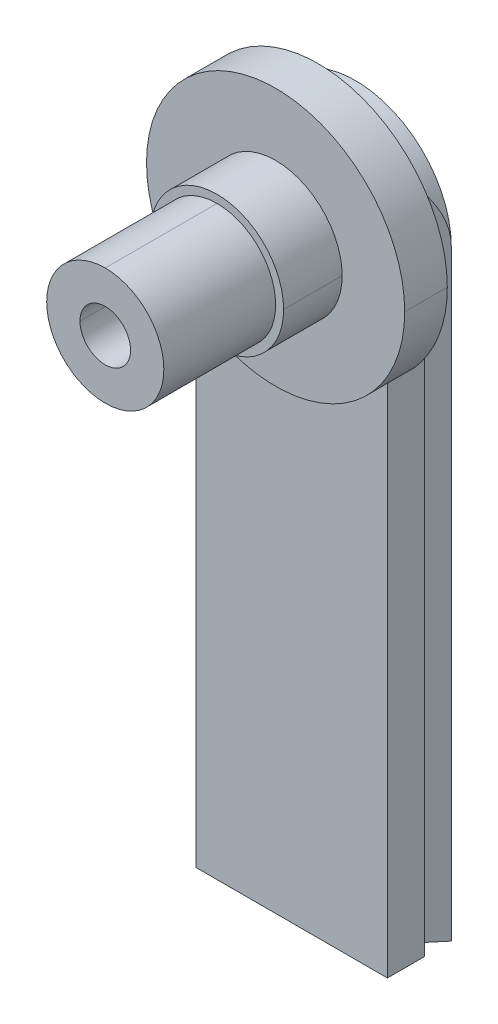
ISO-10303-21;
HEADER;
FILE_DESCRIPTION(('STEP AP214'),'2;1');
FILE_NAME('part.step','',(''),(''),'','','');
FILE_SCHEMA(('AUTOMOTIVE_DESIGN { 1 0 10303 214 1 1 1 1 }'));
ENDSEC;
DATA;
#1=APPLICATION_CONTEXT('core data for automotive mechanical design processes');
#2=APPLICATION_PROTOCOL_DEFINITION('international standard','automotive_design',2000,#1);
#3=PRODUCT_CONTEXT('',#1,'mechanical');
#4=PRODUCT('Part','Part','',(#3));
#5=PRODUCT_RELATED_PRODUCT_CATEGORY('part','',(#4));
#6=PRODUCT_DEFINITION_FORMATION('','',#4);
#7=PRODUCT_DEFINITION_CONTEXT('part definition',#1,'design');
#8=PRODUCT_DEFINITION('design','',#6,#7);
#9=PRODUCT_DEFINITION_SHAPE('','',#8);
#10=(LENGTH_UNIT() NAMED_UNIT(*) SI_UNIT(.MILLI.,.METRE.));
#11=(NAMED_UNIT(*) PLANE_ANGLE_UNIT() SI_UNIT($,.RADIAN.));
#12=(NAMED_UNIT(*) SI_UNIT($,.STERADIAN.) SOLID_ANGLE_UNIT());
#13=UNCERTAINTY_MEASURE_WITH_UNIT(LENGTH_MEASURE(1.E-05),#10,'distance_accuracy_value','');
#14=(GEOMETRIC_REPRESENTATION_CONTEXT(3) GLOBAL_UNCERTAINTY_ASSIGNED_CONTEXT((#13)) GLOBAL_UNIT_ASSIGNED_CONTEXT((#10,
#11,#12)) REPRESENTATION_CONTEXT('',''));
#15=CARTESIAN_POINT('',(0.,0.,0.));
#16=DIRECTION('',(0.,0.,1.));
#17=DIRECTION('',(1.,0.,0.));
#18=AXIS2_PLACEMENT_3D('',#15,#16,#17);
#19=CARTESIAN_POINT('',(2.024,-111.524,-9.));
#20=DIRECTION('',(0.,0.,-1.));
#21=DIRECTION('',(0.,-1.,0.));
#22=AXIS2_PLACEMENT_3D('',#19,#20,#21);
#23=PLANE('',#22);
#24=CARTESIAN_POINT('',(0.,-109.5,-9.));
#25=DIRECTION('',(0.,0.,1.));
#26=DIRECTION('',(-1.,0.,0.));
#27=AXIS2_PLACEMENT_3D('',#24,#25,#26);
#28=CIRCLE('',#27,2.);
#29=CARTESIAN_POINT('',(-2.,-109.5,-9.));
#30=VERTEX_POINT('',#29);
#31=CARTESIAN_POINT('',(2.,-109.5,-9.));
#32=VERTEX_POINT('',#31);
#33=EDGE_CURVE('E293',#30,#32,#28,.T.);
#34=ORIENTED_EDGE('',*,*,#33,.F.);
#35=CARTESIAN_POINT('',(0.,-109.5,-9.));
#36=DIRECTION('',(0.,0.,1.));
#37=DIRECTION('',(-1.,0.,0.));
#38=AXIS2_PLACEMENT_3D('',#35,#36,#37);
#39=CIRCLE('',#38,2.);
#40=EDGE_CURVE('E11',#32,#30,#39,.T.);
#41=ORIENTED_EDGE('',*,*,#40,.F.);
#42=EDGE_LOOP('',(#34,#41));
#43=FACE_BOUND('',#42,.T.);
#44=ADVANCED_FACE('F16',(#43),#23,.T.);
#45=CARTESIAN_POINT('',(0.,-109.5,-9.));
#46=DIRECTION('',(0.,0.,-1.));
#47=DIRECTION('',(-1.,0.,0.));
#48=AXIS2_PLACEMENT_3D('',#45,#46,#47);
#49=CYLINDRICAL_SURFACE('',#48,2.);
#50=DIRECTION('',(0.,0.,-1.));
#51=VECTOR('',#50,1.);
#52=CARTESIAN_POINT('',(2.,-109.5,-9.));
#53=LINE('',#52,#51);
#54=CARTESIAN_POINT('',(2.00000000010245,-109.500000000308,-10.1339745965269));
#55=VERTEX_POINT('',#54);
#56=EDGE_CURVE('E252',#32,#55,#53,.T.);
#57=ORIENTED_EDGE('',*,*,#56,.F.);
#58=ORIENTED_EDGE('',*,*,#40,.T.);
#59=DIRECTION('',(0.,0.,-1.));
#60=VECTOR('',#59,1.);
#61=CARTESIAN_POINT('',(-2.,-109.5,-9.));
#62=LINE('',#61,#60);
#63=CARTESIAN_POINT('',(-2.00000000010246,-109.50000000009,-10.1339745965269));
#64=VERTEX_POINT('',#63);
#65=EDGE_CURVE('E251',#30,#64,#62,.T.);
#66=ORIENTED_EDGE('',*,*,#65,.T.);
#67=CARTESIAN_POINT('',(0.,-109.5,-10.1339745965269));
#68=DIRECTION('',(0.,0.,1.));
#69=DIRECTION('',(0.,-1.,0.));
#70=AXIS2_PLACEMENT_3D('',#67,#68,#69);
#71=CIRCLE('',#70,2.00000000013662);
#72=EDGE_CURVE('E26',#55,#64,#71,.T.);
#73=ORIENTED_EDGE('',*,*,#72,.F.);
#74=EDGE_LOOP('',(#57,#58,#66,#73));
#75=FACE_BOUND('',#74,.T.);
#76=ADVANCED_FACE('F1017',(#75),#49,.F.);
#77=CARTESIAN_POINT('',(-2.004995835,-109.5,-10.03414118));
#78=CARTESIAN_POINT('',(-2.004995835,-105.490008331,-10.03414118));
#79=CARTESIAN_POINT('',(2.004995835,-105.490008331,-10.03414118));
#80=CARTESIAN_POINT('',(2.004995835,-109.5,-10.03414118));
#81=CARTESIAN_POINT('',(-1.960553427,-109.5,-10.47708285));
#82=CARTESIAN_POINT('',(-1.960553427,-105.578893145,-10.47708285));
#83=CARTESIAN_POINT('',(1.960553427,-105.578893145,-10.47708285));
#84=CARTESIAN_POINT('',(1.960553427,-109.5,-10.47708285));
#85=CARTESIAN_POINT('',(-2.18313625,-109.5,-10.862607607));
#86=CARTESIAN_POINT('',(-2.18313625,-105.133727501,-10.862607607));
#87=CARTESIAN_POINT('',(2.18313625,-105.133727501,-10.862607607));
#88=CARTESIAN_POINT('',(2.18313625,-109.5,-10.862607607));
#89=CARTESIAN_POINT('',(-2.588956192,-109.5,-11.045590189));
#90=CARTESIAN_POINT('',(-2.588956192,-104.322087615,-11.045590189));
#91=CARTESIAN_POINT('',(2.588956192,-104.322087615,-11.045590189));
#92=CARTESIAN_POINT('',(2.588956192,-109.5,-11.045590189));
#93=(BOUNDED_SURFACE() B_SPLINE_SURFACE(3,3,((#77,#78,#79,#80),(#81,#82,#83,#84),(#85,#86,#87,
#88),(#89,#90,#91,#92)),.UNSPECIFIED.,.F.,.F.,.F.) B_SPLINE_SURFACE_WITH_KNOTS((4,4),(4,4),(0.,
1.),(0.,1.),.UNSPECIFIED.) GEOMETRIC_REPRESENTATION_ITEM() RATIONAL_B_SPLINE_SURFACE(((1.,
0.333333333333333,0.333333333333333,1.),(0.874521450452457,0.291507150150819,0.291507150150819,
0.874521450452457),(0.874521450452457,0.291507150150819,0.291507150150819,0.874521450452457),
(1.,0.333333333333333,0.333333333333333,1.))) REPRESENTATION_ITEM('') SURFACE());
#94=CARTESIAN_POINT('',(-2.50000000005074,-109.5,-10.9999999999377));
#95=CARTESIAN_POINT('',(-2.18301270204156,-109.5,-10.8169872981414));
#96=CARTESIAN_POINT('',(-1.99999999969705,-109.5,-10.5000000000049));
#97=CARTESIAN_POINT('',(-2.00000000010246,-109.50000000009,-10.1339745965269));
#98=(BOUNDED_CURVE() B_SPLINE_CURVE(3,(#94,#95,#96,#97),.UNSPECIFIED.,.F.,
.F.) B_SPLINE_CURVE_WITH_KNOTS((4,4),(0.0843334530139823,0.915666547000002),
.UNSPECIFIED.) CURVE() GEOMETRIC_REPRESENTATION_ITEM() RATIONAL_B_SPLINE_CURVE((0.970931141670525,
0.884211069894157,0.884211069895616,0.970931141674901)) REPRESENTATION_ITEM(''));
#99=CARTESIAN_POINT('',(-2.50000000005075,-109.5,-10.9999999999377));
#100=VERTEX_POINT('',#99);
#101=EDGE_CURVE('E303',#100,#64,#98,.T.);
#102=CARTESIAN_POINT('',(0.,-109.5,-10.9999999997949));
#103=DIRECTION('',(0.,0.,1.));
#104=DIRECTION('',(0.,-1.,0.));
#105=AXIS2_PLACEMENT_3D('',#102,#103,#104);
#106=CIRCLE('',#105,2.50000000013318);
#107=CARTESIAN_POINT('',(2.50000000005075,-109.5,-10.9999999999377));
#108=VERTEX_POINT('',#107);
#109=EDGE_CURVE('E309',#108,#100,#106,.T.);
#110=CARTESIAN_POINT('',(2.00000000010246,-109.500000000308,-10.1339745965269));
#111=CARTESIAN_POINT('',(1.99999999969705,-109.5,-10.5000000000049));
#112=CARTESIAN_POINT('',(2.18301270204155,-109.5,-10.8169872981414));
#113=CARTESIAN_POINT('',(2.50000000005074,-109.5,-10.9999999999377));
#114=(BOUNDED_CURVE() B_SPLINE_CURVE(3,(#110,#111,#112,#113),.UNSPECIFIED.,.F.,
.F.) B_SPLINE_CURVE_WITH_KNOTS((4,4),(0.0843334529999964,0.915666546986018),
.UNSPECIFIED.) CURVE() GEOMETRIC_REPRESENTATION_ITEM() RATIONAL_B_SPLINE_CURVE((0.970931141674902,
0.884211069895616,0.884211069894156,0.970931141670525)) REPRESENTATION_ITEM(''));
#115=EDGE_CURVE('E41',#55,#108,#114,.T.);
#116=ORIENTED_EDGE('',*,*,#72,.T.);
#117=ORIENTED_EDGE('',*,*,#101,.F.);
#118=ORIENTED_EDGE('',*,*,#109,.F.);
#119=ORIENTED_EDGE('',*,*,#115,.F.);
#120=EDGE_LOOP('',(#116,#117,#118,#119));
#121=FACE_BOUND('',#120,.T.);
#122=ADVANCED_FACE('F946',(#121),#93,.T.);
#123=CARTESIAN_POINT('',(2.004995835,-109.5,-10.03414118));
#124=CARTESIAN_POINT('',(2.004995835,-113.509991669,-10.03414118));
#125=CARTESIAN_POINT('',(-2.004995835,-113.509991669,-10.03414118));
#126=CARTESIAN_POINT('',(-2.004995835,-109.5,-10.03414118));
#127=CARTESIAN_POINT('',(1.960553427,-109.5,-10.47708285));
#128=CARTESIAN_POINT('',(1.960553427,-113.421106855,-10.47708285));
#129=CARTESIAN_POINT('',(-1.960553427,-113.421106855,-10.47708285));
#130=CARTESIAN_POINT('',(-1.960553427,-109.5,-10.47708285));
#131=CARTESIAN_POINT('',(2.18313625,-109.5,-10.862607607));
#132=CARTESIAN_POINT('',(2.18313625,-113.866272499,-10.862607607));
#133=CARTESIAN_POINT('',(-2.18313625,-113.866272499,-10.862607607));
#134=CARTESIAN_POINT('',(-2.18313625,-109.5,-10.862607607));
#135=CARTESIAN_POINT('',(2.588956192,-109.5,-11.045590189));
#136=CARTESIAN_POINT('',(2.588956192,-114.677912385,-11.045590189));
#137=CARTESIAN_POINT('',(-2.588956192,-114.677912385,-11.045590189));
#138=CARTESIAN_POINT('',(-2.588956192,-109.5,-11.045590189));
#139=(BOUNDED_SURFACE() B_SPLINE_SURFACE(3,3,((#123,#124,#125,#126),(#127,#128,#129,#130),(#131,
#132,#133,#134),(#135,#136,#137,#138)),.UNSPECIFIED.,.F.,.F.,
.F.) B_SPLINE_SURFACE_WITH_KNOTS((4,4),(4,4),(0.,1.),(0.,1.),
.UNSPECIFIED.) GEOMETRIC_REPRESENTATION_ITEM() RATIONAL_B_SPLINE_SURFACE(((1.,0.333333333333333,
0.333333333333333,1.),(0.874521450452457,0.291507150150819,0.291507150150819,0.874521450452457),
(0.874521450452457,0.291507150150819,0.291507150150819,0.874521450452457),(1.,0.333333333333333,
0.333333333333333,1.))) REPRESENTATION_ITEM('') SURFACE());
#140=CARTESIAN_POINT('',(0.,-109.5,-10.1339745965269));
#141=DIRECTION('',(0.,0.,1.));
#142=DIRECTION('',(0.,-1.,0.));
#143=AXIS2_PLACEMENT_3D('',#140,#141,#142);
#144=CIRCLE('',#143,2.00000000013662);
#145=EDGE_CURVE('E248',#64,#55,#144,.T.);
#146=CARTESIAN_POINT('',(0.,-109.5,-10.9999999997949));
#147=DIRECTION('',(0.,0.,1.));
#148=DIRECTION('',(0.,-1.,0.));
#149=AXIS2_PLACEMENT_3D('',#146,#147,#148);
#150=CIRCLE('',#149,2.50000000013318);
#151=EDGE_CURVE('E237',#100,#108,#150,.T.);
#152=ORIENTED_EDGE('',*,*,#101,.T.);
#153=ORIENTED_EDGE('',*,*,#145,.T.);
#154=ORIENTED_EDGE('',*,*,#115,.T.);
#155=ORIENTED_EDGE('',*,*,#151,.F.);
#156=EDGE_LOOP('',(#152,#153,#154,#155));
#157=FACE_BOUND('',#156,.T.);
#158=ADVANCED_FACE('F941',(#157),#139,.T.);
#159=CARTESIAN_POINT('',(-2.400166583,-109.5,-10.995004165));
#160=CARTESIAN_POINT('',(-2.400166583,-104.699666833,-10.995004165));
#161=CARTESIAN_POINT('',(2.400166583,-104.699666833,-10.995004165));
#162=CARTESIAN_POINT('',(2.400166583,-109.5,-10.995004165));
#163=CARTESIAN_POINT('',(-3.080053765,-109.5,-11.063220423));
#164=CARTESIAN_POINT('',(-3.080053765,-103.33989247,-11.063220423));
#165=CARTESIAN_POINT('',(3.080053765,-103.33989247,-11.063220423));
#166=CARTESIAN_POINT('',(3.080053765,-109.5,-11.063220423));
#167=CARTESIAN_POINT('',(-3.563220423,-109.5,-10.580053765));
#168=CARTESIAN_POINT('',(-3.563220423,-102.373559155,-10.580053765));
#169=CARTESIAN_POINT('',(3.563220423,-102.373559155,-10.580053765));
#170=CARTESIAN_POINT('',(3.563220423,-109.5,-10.580053765));
#171=CARTESIAN_POINT('',(-3.495004165,-109.5,-9.900166583));
#172=CARTESIAN_POINT('',(-3.495004165,-102.509991669,-9.90016658300001));
#173=CARTESIAN_POINT('',(3.495004165,-102.509991669,-9.90016658300001));
#174=CARTESIAN_POINT('',(3.495004165,-109.5,-9.900166583));
#175=(BOUNDED_SURFACE() B_SPLINE_SURFACE(3,3,((#159,#160,#161,#162),(#163,#164,#165,#166),(#167,
#168,#169,#170),(#171,#172,#173,#174)),.UNSPECIFIED.,.F.,.F.,
.F.) B_SPLINE_SURFACE_WITH_KNOTS((4,4),(4,4),(0.,1.),(0.,1.),
.UNSPECIFIED.) GEOMETRIC_REPRESENTATION_ITEM() RATIONAL_B_SPLINE_SURFACE(((1.,0.333333333333333,
0.333333333333333,1.),(0.755320871117972,0.251773623705991,0.251773623705991,0.755320871117972),
(0.755320871117972,0.251773623705991,0.251773623705991,0.755320871117972),(1.,0.333333333333333,
0.333333333333333,1.))) REPRESENTATION_ITEM('') SURFACE());
#176=CARTESIAN_POINT('',(-3.49999999994874,-109.500000001077,-10.0000000000333));
#177=CARTESIAN_POINT('',(-3.49999999990589,-109.5,-10.5857864374829));
#178=CARTESIAN_POINT('',(-3.08578643748291,-109.5,-10.9999999999059));
#179=CARTESIAN_POINT('',(-2.50000000005075,-109.5,-10.9999999999377));
#180=(BOUNDED_CURVE() B_SPLINE_CURVE(3,(#176,#177,#178,#179),.UNSPECIFIED.,.F.,
.F.) B_SPLINE_CURVE_WITH_KNOTS((4,4),(0.0631414570000006,0.936858543),
.UNSPECIFIED.) CURVE() GEOMETRIC_REPRESENTATION_ITEM() RATIONAL_B_SPLINE_CURVE((0.956578302165993,
0.769794770395974,0.769794770395974,0.956578302165993)) REPRESENTATION_ITEM(''));
#181=CARTESIAN_POINT('',(-3.49999999994874,-109.500000001077,-10.0000000000333));
#182=VERTEX_POINT('',#181);
#183=EDGE_CURVE('E231',#182,#100,#180,.T.);
#184=CARTESIAN_POINT('',(0.,-109.5,-10.));
#185=DIRECTION('',(0.,0.,-1.));
#186=DIRECTION('',(1.,0.,0.));
#187=AXIS2_PLACEMENT_3D('',#184,#185,#186);
#188=CIRCLE('',#187,3.5);
#189=CARTESIAN_POINT('',(0.,-106.,-10.));
#190=VERTEX_POINT('',#189);
#191=EDGE_CURVE('E274',#182,#190,#188,.T.);
#192=CARTESIAN_POINT('',(0.,-109.5,-10.));
#193=DIRECTION('',(0.,0.,-1.));
#194=DIRECTION('',(1.,0.,0.));
#195=AXIS2_PLACEMENT_3D('',#192,#193,#194);
#196=CIRCLE('',#195,3.5);
#197=CARTESIAN_POINT('',(3.49999999994874,-109.500000000314,-10.));
#198=VERTEX_POINT('',#197);
#199=EDGE_CURVE('E356',#190,#198,#196,.T.);
#200=CARTESIAN_POINT('',(2.50000000005074,-109.5,-10.9999999999377));
#201=CARTESIAN_POINT('',(3.08578643755146,-109.5,-10.9999999999059));
#202=CARTESIAN_POINT('',(3.4999999999839,-109.5,-10.5857864374049));
#203=CARTESIAN_POINT('',(3.49999999994874,-109.500000000314,-10.));
#204=(BOUNDED_CURVE() B_SPLINE_CURVE(3,(#200,#201,#202,#203),.UNSPECIFIED.,.F.,
.F.) B_SPLINE_CURVE_WITH_KNOTS((4,4),(0.0631414569999998,0.936858543082279),
.UNSPECIFIED.) CURVE() GEOMETRIC_REPRESENTATION_ITEM() RATIONAL_B_SPLINE_CURVE((0.956578302165993,
0.769794770378385,0.769794770395974,0.956578302218762)) REPRESENTATION_ITEM(''));
#205=EDGE_CURVE('E355',#108,#198,#204,.T.);
#206=ORIENTED_EDGE('',*,*,#109,.T.);
#207=ORIENTED_EDGE('',*,*,#183,.F.);
#208=ORIENTED_EDGE('',*,*,#191,.T.);
#209=ORIENTED_EDGE('',*,*,#199,.T.);
#210=ORIENTED_EDGE('',*,*,#205,.F.);
#211=EDGE_LOOP('',(#206,#207,#208,#209,#210));
#212=FACE_BOUND('',#211,.T.);
#213=ADVANCED_FACE('F945',(#212),#175,.T.);
#214=CARTESIAN_POINT('',(2.400166583,-109.5,-10.995004165));
#215=CARTESIAN_POINT('',(2.400166583,-114.300333167,-10.995004165));
#216=CARTESIAN_POINT('',(-2.400166583,-114.300333167,-10.995004165));
#217=CARTESIAN_POINT('',(-2.400166583,-109.5,-10.995004165));
#218=CARTESIAN_POINT('',(3.080053765,-109.5,-11.063220423));
#219=CARTESIAN_POINT('',(3.080053765,-115.66010753,-11.063220423));
#220=CARTESIAN_POINT('',(-3.080053765,-115.66010753,-11.063220423));
#221=CARTESIAN_POINT('',(-3.080053765,-109.5,-11.063220423));
#222=CARTESIAN_POINT('',(3.563220423,-109.5,-10.580053765));
#223=CARTESIAN_POINT('',(3.563220423,-116.626440845,-10.580053765));
#224=CARTESIAN_POINT('',(-3.563220423,-116.626440845,-10.580053765));
#225=CARTESIAN_POINT('',(-3.563220423,-109.5,-10.580053765));
#226=CARTESIAN_POINT('',(3.495004165,-109.5,-9.900166583));
#227=CARTESIAN_POINT('',(3.495004165,-116.490008331,-9.90016658300001));
#228=CARTESIAN_POINT('',(-3.495004165,-116.490008331,-9.90016658300001));
#229=CARTESIAN_POINT('',(-3.495004165,-109.5,-9.900166583));
#230=(BOUNDED_SURFACE() B_SPLINE_SURFACE(3,3,((#214,#215,#216,#217),(#218,#219,#220,#221),(#222,
#223,#224,#225),(#226,#227,#228,#229)),.UNSPECIFIED.,.F.,.F.,
.F.) B_SPLINE_SURFACE_WITH_KNOTS((4,4),(4,4),(0.,1.),(0.,1.),
.UNSPECIFIED.) GEOMETRIC_REPRESENTATION_ITEM() RATIONAL_B_SPLINE_SURFACE(((1.,0.333333333333333,
0.333333333333333,1.),(0.755320871117972,0.251773623705991,0.251773623705991,0.755320871117972),
(0.755320871117972,0.251773623705991,0.251773623705991,0.755320871117972),(1.,0.333333333333333,
0.333333333333333,1.))) REPRESENTATION_ITEM('') SURFACE());
#231=CARTESIAN_POINT('',(0.,-109.5,-10.));
#232=DIRECTION('',(0.,0.,-1.));
#233=DIRECTION('',(1.,0.,0.));
#234=AXIS2_PLACEMENT_3D('',#231,#232,#233);
#235=CIRCLE('',#234,3.5);
#236=CARTESIAN_POINT('',(0.,-113.,-10.));
#237=VERTEX_POINT('',#236);
#238=EDGE_CURVE('E315',#198,#237,#235,.T.);
#239=CARTESIAN_POINT('',(0.,-109.5,-10.));
#240=DIRECTION('',(0.,0.,-1.));
#241=DIRECTION('',(1.,0.,0.));
#242=AXIS2_PLACEMENT_3D('',#239,#240,#241);
#243=CIRCLE('',#242,3.5);
#244=EDGE_CURVE('E238',#237,#182,#243,.T.);
#245=ORIENTED_EDGE('',*,*,#183,.T.);
#246=ORIENTED_EDGE('',*,*,#151,.T.);
#247=ORIENTED_EDGE('',*,*,#205,.T.);
#248=ORIENTED_EDGE('',*,*,#238,.T.);
#249=ORIENTED_EDGE('',*,*,#244,.T.);
#250=EDGE_LOOP('',(#245,#246,#247,#248,#249));
#251=FACE_BOUND('',#250,.T.);
#252=ADVANCED_FACE('F1052',(#251),#230,.T.);
#253=CARTESIAN_POINT('',(0.,-109.5,-10.));
#254=DIRECTION('',(0.,0.,1.));
#255=DIRECTION('',(0.,-1.,0.));
#256=AXIS2_PLACEMENT_3D('',#253,#254,#255);
#257=CYLINDRICAL_SURFACE('',#256,3.5);
#258=DIRECTION('',(0.,0.,1.));
#259=VECTOR('',#258,1.);
#260=CARTESIAN_POINT('',(0.,-106.,-10.));
#261=LINE('',#260,#259);
#262=CARTESIAN_POINT('',(0.,-106.,-7.));
#263=VERTEX_POINT('',#262);
#264=EDGE_CURVE('E264',#190,#263,#261,.T.);
#265=ORIENTED_EDGE('',*,*,#264,.F.);
#266=ORIENTED_EDGE('',*,*,#191,.F.);
#267=ORIENTED_EDGE('',*,*,#244,.F.);
#268=DIRECTION('',(0.,0.,1.));
#269=VECTOR('',#268,1.);
#270=CARTESIAN_POINT('',(0.,-113.,-10.));
#271=LINE('',#270,#269);
#272=CARTESIAN_POINT('',(-6.73207252246756E-10,-113.,-7.));
#273=VERTEX_POINT('',#272);
#274=EDGE_CURVE('E263',#237,#273,#271,.T.);
#275=ORIENTED_EDGE('',*,*,#274,.T.);
#276=CARTESIAN_POINT('',(0.,-109.5,-7.));
#277=DIRECTION('',(0.,0.,1.));
#278=DIRECTION('',(0.,-1.,0.));
#279=AXIS2_PLACEMENT_3D('',#276,#277,#278);
#280=CIRCLE('',#279,3.5);
#281=EDGE_CURVE('E283',#263,#273,#280,.T.);
#282=ORIENTED_EDGE('',*,*,#281,.F.);
#283=EDGE_LOOP('',(#265,#266,#267,#275,#282));
#284=FACE_BOUND('',#283,.T.);
#285=ADVANCED_FACE('F1039',(#284),#257,.T.);
#286=CARTESIAN_POINT('',(-13.8,-113.,-2.));
#287=DIRECTION('',(0.765704864789611,0.,-0.643192086423273));
#288=DIRECTION('',(0.,-1.,0.));
#289=AXIS2_PLACEMENT_3D('',#286,#287,#288);
#290=PLANE('',#289);
#291=DIRECTION('',(0.,1.,0.));
#292=VECTOR('',#291,1.);
#293=CARTESIAN_POINT('',(-18.,-47.107,-7.));
#294=LINE('',#293,#292);
#295=CARTESIAN_POINT('',(-18.,-113.,-7.));
#296=VERTEX_POINT('',#295);
#297=CARTESIAN_POINT('',(-18.,0.,-7.));
#298=VERTEX_POINT('',#297);
#299=EDGE_CURVE('E207',#296,#298,#294,.T.);
#300=ORIENTED_EDGE('',*,*,#299,.F.);
#301=DIRECTION('',(-0.643192087199034,0.,-0.765704864137972));
#302=VECTOR('',#301,1.);
#303=CARTESIAN_POINT('',(-13.799999988,-113.,-1.999999996));
#304=LINE('',#303,#302);
#305=CARTESIAN_POINT('',(-13.799999994,-113.,-1.999999997));
#306=VERTEX_POINT('',#305);
#307=EDGE_CURVE('E201',#306,#296,#304,.T.);
#308=ORIENTED_EDGE('',*,*,#307,.F.);
#309=DIRECTION('',(0.,1.,0.));
#310=VECTOR('',#309,1.);
#311=CARTESIAN_POINT('',(-13.8,-50.347921466,-2.));
#312=LINE('',#311,#310);
#313=CARTESIAN_POINT('',(-13.80000000084,11.5568161695519,-2.000000001));
#314=VERTEX_POINT('',#313);
#315=EDGE_CURVE('E187',#306,#314,#312,.T.);
#316=ORIENTED_EDGE('',*,*,#315,.T.);
#317=CARTESIAN_POINT('',(-13.80000000084,11.5568161695519,-2.000000001));
#318=CARTESIAN_POINT('',(-16.5415229921221,8.28316218674712,-5.26371784776441));
#319=CARTESIAN_POINT('',(-18.,4.26998345557237,-6.99999999999999));
#320=CARTESIAN_POINT('',(-18.,0.,-7.));
#321=(BOUNDED_CURVE() B_SPLINE_CURVE(3,(#317,#318,#319,#320),.UNSPECIFIED.,.F.,
.F.) B_SPLINE_CURVE_WITH_KNOTS((4,4),(5.58602217361004,6.28318530717959),
.UNSPECIFIED.) CURVE() GEOMETRIC_REPRESENTATION_ITEM() RATIONAL_B_SPLINE_CURVE((1.,
0.959905430224795,0.959905430224795,1.)) REPRESENTATION_ITEM(''));
#322=EDGE_CURVE('E269',#314,#298,#321,.T.);
#323=ORIENTED_EDGE('',*,*,#322,.T.);
#324=EDGE_LOOP('',(#300,#308,#316,#323));
#325=FACE_BOUND('',#324,.T.);
#326=ADVANCED_FACE('F205',(#325),#290,.F.);
#327=CARTESIAN_POINT('',(18.,-113.,-7.));
#328=DIRECTION('',(0.,0.,-1.));
#329=DIRECTION('',(0.,-1.,0.));
#330=AXIS2_PLACEMENT_3D('',#327,#328,#329);
#331=PLANE('',#330);
#332=ORIENTED_EDGE('',*,*,#299,.T.);
#333=CARTESIAN_POINT('',(0.,0.,-7.));
#334=DIRECTION('',(0.,0.,-1.));
#335=DIRECTION('',(-1.,0.,0.));
#336=AXIS2_PLACEMENT_3D('',#333,#334,#335);
#337=CIRCLE('',#336,18.);
#338=CARTESIAN_POINT('',(18.,0.,-7.));
#339=VERTEX_POINT('',#338);
#340=EDGE_CURVE('E265',#298,#339,#337,.T.);
#341=ORIENTED_EDGE('',*,*,#340,.T.);
#342=DIRECTION('',(0.,-1.,0.));
#343=VECTOR('',#342,1.);
#344=CARTESIAN_POINT('',(18.,-50.347921466,-7.));
#345=LINE('',#344,#343);
#346=CARTESIAN_POINT('',(18.,-113.,-7.));
#347=VERTEX_POINT('',#346);
#348=EDGE_CURVE('E451',#339,#347,#345,.T.);
#349=ORIENTED_EDGE('',*,*,#348,.T.);
#350=DIRECTION('',(1.,0.,0.));
#351=VECTOR('',#350,1.);
#352=CARTESIAN_POINT('',(0.,-113.,-7.));
#353=LINE('',#352,#351);
#354=EDGE_CURVE('E19',#273,#347,#353,.T.);
#355=ORIENTED_EDGE('',*,*,#354,.F.);
#356=CARTESIAN_POINT('',(0.,-109.5,-7.));
#357=DIRECTION('',(0.,0.,1.));
#358=DIRECTION('',(0.,-1.,0.));
#359=AXIS2_PLACEMENT_3D('',#356,#357,#358);
#360=CIRCLE('',#359,3.5);
#361=EDGE_CURVE('E259',#273,#263,#360,.T.);
#362=ORIENTED_EDGE('',*,*,#361,.T.);
#363=ORIENTED_EDGE('',*,*,#281,.T.);
#364=DIRECTION('',(1.,0.,0.));
#365=VECTOR('',#364,1.);
#366=CARTESIAN_POINT('',(0.,-113.,-7.));
#367=LINE('',#366,#365);
#368=EDGE_CURVE('E432',#296,#273,#367,.T.);
#369=ORIENTED_EDGE('',*,*,#368,.F.);
#370=EDGE_LOOP('',(#332,#341,#349,#355,#362,#363,#369));
#371=FACE_BOUND('',#370,.T.);
#372=ADVANCED_FACE('F1038',(#371),#331,.T.);
#373=CARTESIAN_POINT('',(18.,-113.,-7.));
#374=DIRECTION('',(-0.765704864789611,0.,-0.643192086423273));
#375=DIRECTION('',(-0.643192086423273,0.,0.765704864789611));
#376=AXIS2_PLACEMENT_3D('',#373,#374,#375);
#377=PLANE('',#376);
#378=DIRECTION('',(0.,-1.,0.));
#379=VECTOR('',#378,1.);
#380=CARTESIAN_POINT('',(13.8,-50.347921466,-2.));
#381=LINE('',#380,#379);
#382=CARTESIAN_POINT('',(13.80000000084,11.5568161695519,-2.000000001));
#383=VERTEX_POINT('',#382);
#384=CARTESIAN_POINT('',(13.799999994,-113.,-1.999999997));
#385=VERTEX_POINT('',#384);
#386=EDGE_CURVE('E200',#383,#385,#381,.T.);
#387=ORIENTED_EDGE('',*,*,#386,.T.);
#388=DIRECTION('',(-0.643192087199034,0.,0.765704864137972));
#389=VECTOR('',#388,1.);
#390=CARTESIAN_POINT('',(18.,-113.,-7.));
#391=LINE('',#390,#389);
#392=EDGE_CURVE('E225',#347,#385,#391,.T.);
#393=ORIENTED_EDGE('',*,*,#392,.F.);
#394=ORIENTED_EDGE('',*,*,#348,.F.);
#395=CARTESIAN_POINT('',(18.,0.,-7.));
#396=CARTESIAN_POINT('',(18.,4.26998345557238,-7.00000000000001));
#397=CARTESIAN_POINT('',(16.5415229921221,8.28316218674714,-5.26371784776441));
#398=CARTESIAN_POINT('',(13.80000000084,11.5568161695519,-2.000000001));
#399=(BOUNDED_CURVE() B_SPLINE_CURVE(3,(#395,#396,#397,#398),.UNSPECIFIED.,.F.,
.F.) B_SPLINE_CURVE_WITH_KNOTS((4,4),(0.,0.697163133569548),
.UNSPECIFIED.) CURVE() GEOMETRIC_REPRESENTATION_ITEM() RATIONAL_B_SPLINE_CURVE((1.,
0.959905430224795,0.959905430224795,1.)) REPRESENTATION_ITEM(''));
#400=EDGE_CURVE('E426',#339,#383,#399,.T.);
#401=ORIENTED_EDGE('',*,*,#400,.T.);
#402=EDGE_LOOP('',(#387,#393,#394,#401));
#403=FACE_BOUND('',#402,.T.);
#404=ADVANCED_FACE('F1094',(#403),#377,.F.);
#405=CARTESIAN_POINT('',(13.8,-113.,-2.));
#406=DIRECTION('',(0.,0.,1.));
#407=DIRECTION('',(1.,0.,0.));
#408=AXIS2_PLACEMENT_3D('',#405,#406,#407);
#409=PLANE('',#408);
#410=DIRECTION('',(0.,1.,0.));
#411=VECTOR('',#410,1.);
#412=CARTESIAN_POINT('',(18.,-56.5,-2.));
#413=LINE('',#412,#411);
#414=CARTESIAN_POINT('',(18.,-113.,-1.99999999866667));
#415=VERTEX_POINT('',#414);
#416=CARTESIAN_POINT('',(18.,0.,-2.000000001));
#417=VERTEX_POINT('',#416);
#418=EDGE_CURVE('E387',#415,#417,#413,.T.);
#419=ORIENTED_EDGE('',*,*,#418,.F.);
#420=DIRECTION('',(1.,0.,0.));
#421=VECTOR('',#420,1.);
#422=CARTESIAN_POINT('',(0.,-113.,-1.999999996));
#423=LINE('',#422,#421);
#424=EDGE_CURVE('E219',#385,#415,#423,.T.);
#425=ORIENTED_EDGE('',*,*,#424,.F.);
#426=ORIENTED_EDGE('',*,*,#386,.F.);
#427=CARTESIAN_POINT('',(0.,0.,-2.000000002));
#428=DIRECTION('',(0.,0.,-1.));
#429=DIRECTION('',(-1.,0.,0.));
#430=AXIS2_PLACEMENT_3D('',#427,#428,#429);
#431=CIRCLE('',#430,18.);
#432=EDGE_CURVE('E433',#383,#417,#431,.T.);
#433=ORIENTED_EDGE('',*,*,#432,.T.);
#434=EDGE_LOOP('',(#419,#425,#426,#433));
#435=FACE_BOUND('',#434,.T.);
#436=ADVANCED_FACE('F569',(#435),#409,.F.);
#437=CARTESIAN_POINT('',(-18.,-113.,-2.));
#438=DIRECTION('',(0.,0.,1.));
#439=DIRECTION('',(1.,0.,0.));
#440=AXIS2_PLACEMENT_3D('',#437,#438,#439);
#441=PLANE('',#440);
#442=ORIENTED_EDGE('',*,*,#315,.F.);
#443=DIRECTION('',(1.,0.,0.));
#444=VECTOR('',#443,1.);
#445=CARTESIAN_POINT('',(0.,-113.,-1.999999996));
#446=LINE('',#445,#444);
#447=CARTESIAN_POINT('',(-18.,-113.,-1.99999999866667));
#448=VERTEX_POINT('',#447);
#449=EDGE_CURVE('E192',#448,#306,#446,.T.);
#450=ORIENTED_EDGE('',*,*,#449,.F.);
#451=DIRECTION('',(0.,-1.,0.));
#452=VECTOR('',#451,1.);
#453=CARTESIAN_POINT('',(-18.,-56.5,-2.));
#454=LINE('',#453,#452);
#455=CARTESIAN_POINT('',(-18.,0.,-2.000000001));
#456=VERTEX_POINT('',#455);
#457=EDGE_CURVE('E374',#456,#448,#454,.T.);
#458=ORIENTED_EDGE('',*,*,#457,.F.);
#459=CARTESIAN_POINT('',(0.,0.,-2.000000002));
#460=DIRECTION('',(0.,0.,-1.));
#461=DIRECTION('',(-1.,0.,0.));
#462=AXIS2_PLACEMENT_3D('',#459,#460,#461);
#463=CIRCLE('',#462,18.);
#464=EDGE_CURVE('E195',#456,#314,#463,.T.);
#465=ORIENTED_EDGE('',*,*,#464,.T.);
#466=EDGE_LOOP('',(#442,#450,#458,#465));
#467=FACE_BOUND('',#466,.T.);
#468=ADVANCED_FACE('F189',(#467),#441,.F.);
#469=CARTESIAN_POINT('',(-18.,-113.,5.));
#470=DIRECTION('',(0.,-1.,0.));
#471=DIRECTION('',(0.,0.,-1.));
#472=AXIS2_PLACEMENT_3D('',#469,#470,#471);
#473=PLANE('',#472);
#474=ORIENTED_EDGE('',*,*,#368,.T.);
#475=ORIENTED_EDGE('',*,*,#354,.T.);
#476=ORIENTED_EDGE('',*,*,#392,.T.);
#477=ORIENTED_EDGE('',*,*,#424,.T.);
#478=DIRECTION('',(0.,0.,-1.));
#479=VECTOR('',#478,1.);
#480=CARTESIAN_POINT('',(18.,-113.,1.5));
#481=LINE('',#480,#479);
#482=CARTESIAN_POINT('',(18.,-113.,5.));
#483=VERTEX_POINT('',#482);
#484=EDGE_CURVE('E384',#483,#415,#481,.T.);
#485=ORIENTED_EDGE('',*,*,#484,.F.);
#486=DIRECTION('',(-1.,0.,0.));
#487=VECTOR('',#486,1.);
#488=CARTESIAN_POINT('',(0.,-113.,5.));
#489=LINE('',#488,#487);
#490=CARTESIAN_POINT('',(-18.,-113.,5.));
#491=VERTEX_POINT('',#490);
#492=EDGE_CURVE('E379',#483,#491,#489,.T.);
#493=ORIENTED_EDGE('',*,*,#492,.T.);
#494=DIRECTION('',(0.,0.,1.));
#495=VECTOR('',#494,1.);
#496=CARTESIAN_POINT('',(-18.,-113.,1.5));
#497=LINE('',#496,#495);
#498=EDGE_CURVE('E216',#448,#491,#497,.T.);
#499=ORIENTED_EDGE('',*,*,#498,.F.);
#500=ORIENTED_EDGE('',*,*,#449,.T.);
#501=ORIENTED_EDGE('',*,*,#307,.T.);
#502=EDGE_LOOP('',(#474,#475,#476,#477,#485,#493,#499,#500,#501));
#503=FACE_BOUND('',#502,.T.);
#504=ADVANCED_FACE('F213',(#503),#473,.T.);
#505=CARTESIAN_POINT('',(0.,0.,0.));
#506=DIRECTION('',(0.,0.,-1.));
#507=DIRECTION('',(-1.,0.,0.));
#508=AXIS2_PLACEMENT_3D('',#505,#506,#507);
#509=CYLINDRICAL_SURFACE('',#508,18.);
#510=ORIENTED_EDGE('',*,*,#340,.F.);
#511=ORIENTED_EDGE('',*,*,#322,.F.);
#512=ORIENTED_EDGE('',*,*,#464,.F.);
#513=DIRECTION('',(0.,0.,-1.));
#514=VECTOR('',#513,1.);
#515=CARTESIAN_POINT('',(-18.,0.,1.5));
#516=LINE('',#515,#514);
#517=CARTESIAN_POINT('',(-18.000000001102,0.,0.));
#518=VERTEX_POINT('',#517);
#519=EDGE_CURVE('E370',#518,#456,#516,.T.);
#520=ORIENTED_EDGE('',*,*,#519,.F.);
#521=CARTESIAN_POINT('',(0.,0.,0.));
#522=DIRECTION('',(0.,0.,-1.));
#523=DIRECTION('',(-1.,0.,0.));
#524=AXIS2_PLACEMENT_3D('',#521,#522,#523);
#525=CIRCLE('',#524,18.);
#526=CARTESIAN_POINT('',(18.000000001102,0.,0.));
#527=VERTEX_POINT('',#526);
#528=EDGE_CURVE('E375',#518,#527,#525,.T.);
#529=ORIENTED_EDGE('',*,*,#528,.T.);
#530=DIRECTION('',(0.,0.,1.));
#531=VECTOR('',#530,1.);
#532=CARTESIAN_POINT('',(18.,0.,1.5));
#533=LINE('',#532,#531);
#534=EDGE_CURVE('E270',#417,#527,#533,.T.);
#535=ORIENTED_EDGE('',*,*,#534,.F.);
#536=ORIENTED_EDGE('',*,*,#432,.F.);
#537=ORIENTED_EDGE('',*,*,#400,.F.);
#538=EDGE_LOOP('',(#510,#511,#512,#520,#529,#535,#536,#537));
#539=FACE_BOUND('',#538,.T.);
#540=ADVANCED_FACE('F575',(#539),#509,.T.);
#541=CARTESIAN_POINT('',(18.,-113.,-2.));
#542=DIRECTION('',(1.,0.,0.));
#543=DIRECTION('',(0.,1.,0.));
#544=AXIS2_PLACEMENT_3D('',#541,#542,#543);
#545=PLANE('',#544);
#546=DIRECTION('',(0.,-1.,0.));
#547=VECTOR('',#546,1.);
#548=CARTESIAN_POINT('',(18.,-64.33475,5.));
#549=LINE('',#548,#547);
#550=CARTESIAN_POINT('',(18.0000000018381,-16.2499999979639,5.));
#551=VERTEX_POINT('',#550);
#552=EDGE_CURVE('E380',#551,#483,#549,.T.);
#553=ORIENTED_EDGE('',*,*,#552,.T.);
#554=ORIENTED_EDGE('',*,*,#484,.T.);
#555=ORIENTED_EDGE('',*,*,#418,.T.);
#556=ORIENTED_EDGE('',*,*,#534,.T.);
#557=DIRECTION('',(0.,-1.,0.));
#558=VECTOR('',#557,1.);
#559=CARTESIAN_POINT('',(18.000000002204,4.,0.));
#560=LINE('',#559,#558);
#561=CARTESIAN_POINT('',(18.0000000029402,-16.2499999967432,0.));
#562=VERTEX_POINT('',#561);
#563=EDGE_CURVE('E363',#527,#562,#560,.T.);
#564=ORIENTED_EDGE('',*,*,#563,.T.);
#565=DIRECTION('',(0.,0.,1.));
#566=VECTOR('',#565,1.);
#567=CARTESIAN_POINT('',(18.0000000036762,-16.2499999959278,4.));
#568=LINE('',#567,#566);
#569=EDGE_CURVE('E299',#562,#551,#568,.T.);
#570=ORIENTED_EDGE('',*,*,#569,.T.);
#571=EDGE_LOOP('',(#553,#554,#555,#556,#564,#570));
#572=FACE_BOUND('',#571,.T.);
#573=ADVANCED_FACE('F579',(#572),#545,.T.);
#574=CARTESIAN_POINT('',(18.,-113.,5.));
#575=DIRECTION('',(0.,0.,-1.));
#576=DIRECTION('',(0.,-1.,0.));
#577=AXIS2_PLACEMENT_3D('',#574,#575,#576);
#578=PLANE('',#577);
#579=CARTESIAN_POINT('',(0.,0.,5.));
#580=DIRECTION('',(0.,0.,-1.));
#581=DIRECTION('',(-1.,0.,0.));
#582=AXIS2_PLACEMENT_3D('',#579,#580,#581);
#583=CIRCLE('',#582,24.25);
#584=CARTESIAN_POINT('',(-18.0000000037119,-16.2499999958883,5.));
#585=VERTEX_POINT('',#584);
#586=EDGE_CURVE('E390',#551,#585,#583,.T.);
#587=ORIENTED_EDGE('',*,*,#586,.T.);
#588=DIRECTION('',(0.,1.,0.));
#589=VECTOR('',#588,1.);
#590=CARTESIAN_POINT('',(-18.,-56.5,5.));
#591=LINE('',#590,#589);
#592=EDGE_CURVE('E376',#491,#585,#591,.T.);
#593=ORIENTED_EDGE('',*,*,#592,.F.);
#594=ORIENTED_EDGE('',*,*,#492,.F.);
#595=ORIENTED_EDGE('',*,*,#552,.F.);
#596=EDGE_LOOP('',(#587,#593,#594,#595));
#597=FACE_BOUND('',#596,.T.);
#598=ADVANCED_FACE('F894',(#597),#578,.F.);
#599=CARTESIAN_POINT('',(-18.,0.,-2.));
#600=DIRECTION('',(-1.,0.,0.));
#601=DIRECTION('',(0.,0.,1.));
#602=AXIS2_PLACEMENT_3D('',#599,#600,#601);
#603=PLANE('',#602);
#604=DIRECTION('',(0.,1.,0.));
#605=VECTOR('',#604,1.);
#606=CARTESIAN_POINT('',(-18.000000002204,4.,0.));
#607=LINE('',#606,#605);
#608=CARTESIAN_POINT('',(-18.0000000048139,-16.2499999946677,0.));
#609=VERTEX_POINT('',#608);
#610=EDGE_CURVE('E298',#609,#518,#607,.T.);
#611=ORIENTED_EDGE('',*,*,#610,.T.);
#612=ORIENTED_EDGE('',*,*,#519,.T.);
#613=ORIENTED_EDGE('',*,*,#457,.T.);
#614=ORIENTED_EDGE('',*,*,#498,.T.);
#615=ORIENTED_EDGE('',*,*,#592,.T.);
#616=DIRECTION('',(0.,0.,-1.));
#617=VECTOR('',#616,1.);
#618=CARTESIAN_POINT('',(-18.0000000074238,-16.2499999917767,4.));
#619=LINE('',#618,#617);
#620=EDGE_CURVE('E288',#585,#609,#619,.T.);
#621=ORIENTED_EDGE('',*,*,#620,.T.);
#622=EDGE_LOOP('',(#611,#612,#613,#614,#615,#621));
#623=FACE_BOUND('',#622,.T.);
#624=ADVANCED_FACE('F527',(#623),#603,.T.);
#625=CARTESIAN_POINT('',(-24.541,-16.493,0.));
#626=DIRECTION('',(0.,0.,1.));
#627=DIRECTION('',(1.,0.,0.));
#628=AXIS2_PLACEMENT_3D('',#625,#626,#627);
#629=PLANE('',#628);
#630=ORIENTED_EDGE('',*,*,#610,.F.);
#631=CARTESIAN_POINT('',(0.,0.,0.));
#632=DIRECTION('',(0.,0.,-1.));
#633=DIRECTION('',(-1.,0.,0.));
#634=AXIS2_PLACEMENT_3D('',#631,#632,#633);
#635=CIRCLE('',#634,24.25);
#636=CARTESIAN_POINT('',(-24.25,0.,0.));
#637=VERTEX_POINT('',#636);
#638=EDGE_CURVE('E284',#609,#637,#635,.T.);
#639=ORIENTED_EDGE('',*,*,#638,.T.);
#640=CARTESIAN_POINT('',(0.,0.,0.));
#641=DIRECTION('',(0.,0.,-1.));
#642=DIRECTION('',(-1.,0.,0.));
#643=AXIS2_PLACEMENT_3D('',#640,#641,#642);
#644=CIRCLE('',#643,24.25);
#645=CARTESIAN_POINT('',(24.25,0.,0.));
#646=VERTEX_POINT('',#645);
#647=EDGE_CURVE('E328',#637,#646,#644,.T.);
#648=ORIENTED_EDGE('',*,*,#647,.T.);
#649=CARTESIAN_POINT('',(0.,0.,0.));
#650=DIRECTION('',(0.,0.,-1.));
#651=DIRECTION('',(-1.,0.,0.));
#652=AXIS2_PLACEMENT_3D('',#649,#650,#651);
#653=CIRCLE('',#652,24.25);
#654=EDGE_CURVE('E294',#646,#562,#653,.T.);
#655=ORIENTED_EDGE('',*,*,#654,.T.);
#656=ORIENTED_EDGE('',*,*,#563,.F.);
#657=ORIENTED_EDGE('',*,*,#528,.F.);
#658=EDGE_LOOP('',(#630,#639,#648,#655,#656,#657));
#659=FACE_BOUND('',#658,.T.);
#660=ADVANCED_FACE('F893',(#659),#629,.F.);
#661=CARTESIAN_POINT('',(0.,0.,8.));
#662=DIRECTION('',(0.,0.,-1.));
#663=DIRECTION('',(-1.,0.,0.));
#664=AXIS2_PLACEMENT_3D('',#661,#662,#663);
#665=CYLINDRICAL_SURFACE('',#664,24.25);
#666=DIRECTION('',(0.,0.,-1.));
#667=VECTOR('',#666,1.);
#668=CARTESIAN_POINT('',(24.25,0.,8.));
#669=LINE('',#668,#667);
#670=CARTESIAN_POINT('',(24.25,0.,8.));
#671=VERTEX_POINT('',#670);
#672=EDGE_CURVE('E324',#671,#646,#669,.T.);
#673=ORIENTED_EDGE('',*,*,#672,.F.);
#674=CARTESIAN_POINT('',(0.,0.,8.));
#675=DIRECTION('',(0.,0.,1.));
#676=DIRECTION('',(-1.,0.,0.));
#677=AXIS2_PLACEMENT_3D('',#674,#675,#676);
#678=CIRCLE('',#677,24.25);
#679=CARTESIAN_POINT('',(-24.25,0.,8.));
#680=VERTEX_POINT('',#679);
#681=EDGE_CURVE('E289',#680,#671,#678,.T.);
#682=ORIENTED_EDGE('',*,*,#681,.F.);
#683=DIRECTION('',(0.,0.,-1.));
#684=VECTOR('',#683,1.);
#685=CARTESIAN_POINT('',(-24.25,0.,8.));
#686=LINE('',#685,#684);
#687=EDGE_CURVE('E351',#680,#637,#686,.T.);
#688=ORIENTED_EDGE('',*,*,#687,.T.);
#689=ORIENTED_EDGE('',*,*,#638,.F.);
#690=ORIENTED_EDGE('',*,*,#620,.F.);
#691=ORIENTED_EDGE('',*,*,#586,.F.);
#692=ORIENTED_EDGE('',*,*,#569,.F.);
#693=ORIENTED_EDGE('',*,*,#654,.F.);
#694=EDGE_LOOP('',(#673,#682,#688,#689,#690,#691,#692,#693));
#695=FACE_BOUND('',#694,.T.);
#696=ADVANCED_FACE('F954',(#695),#665,.T.);
#697=CARTESIAN_POINT('',(-24.541,-24.541,8.));
#698=DIRECTION('',(0.,0.,1.));
#699=DIRECTION('',(1.,0.,0.));
#700=AXIS2_PLACEMENT_3D('',#697,#698,#699);
#701=PLANE('',#700);
#702=CARTESIAN_POINT('',(0.,0.,8.));
#703=DIRECTION('',(0.,0.,-1.));
#704=DIRECTION('',(-1.,0.,0.));
#705=AXIS2_PLACEMENT_3D('',#702,#703,#704);
#706=CIRCLE('',#705,12.5);
#707=CARTESIAN_POINT('',(-12.5,0.,8.));
#708=VERTEX_POINT('',#707);
#709=CARTESIAN_POINT('',(12.5,0.,8.));
#710=VERTEX_POINT('',#709);
#711=EDGE_CURVE('E258',#708,#710,#706,.T.);
#712=ORIENTED_EDGE('',*,*,#711,.T.);
#713=CARTESIAN_POINT('',(0.,0.,8.));
#714=DIRECTION('',(0.,0.,-1.));
#715=DIRECTION('',(-1.,0.,0.));
#716=AXIS2_PLACEMENT_3D('',#713,#714,#715);
#717=CIRCLE('',#716,12.5);
#718=EDGE_CURVE('E340',#710,#708,#717,.T.);
#719=ORIENTED_EDGE('',*,*,#718,.T.);
#720=EDGE_LOOP('',(#712,#719));
#721=FACE_BOUND('',#720,.T.);
#722=ORIENTED_EDGE('',*,*,#681,.T.);
#723=CARTESIAN_POINT('',(0.,0.,8.));
#724=DIRECTION('',(0.,0.,1.));
#725=DIRECTION('',(-1.,0.,0.));
#726=AXIS2_PLACEMENT_3D('',#723,#724,#725);
#727=CIRCLE('',#726,24.25);
#728=EDGE_CURVE('E257',#671,#680,#727,.T.);
#729=ORIENTED_EDGE('',*,*,#728,.T.);
#730=EDGE_LOOP('',(#722,#729));
#731=FACE_BOUND('',#730,.T.);
#732=ADVANCED_FACE('F995',(#721,#731),#701,.T.);
#733=CARTESIAN_POINT('',(0.,0.,19.));
#734=DIRECTION('',(0.,0.,-1.));
#735=DIRECTION('',(-1.,0.,0.));
#736=AXIS2_PLACEMENT_3D('',#733,#734,#735);
#737=CYLINDRICAL_SURFACE('',#736,12.5);
#738=DIRECTION('',(0.,0.,-1.));
#739=VECTOR('',#738,1.);
#740=CARTESIAN_POINT('',(12.5,0.,19.));
#741=LINE('',#740,#739);
#742=CARTESIAN_POINT('',(12.5,0.,19.));
#743=VERTEX_POINT('',#742);
#744=EDGE_CURVE('E368',#743,#710,#741,.T.);
#745=ORIENTED_EDGE('',*,*,#744,.F.);
#746=CARTESIAN_POINT('',(0.,0.,19.));
#747=DIRECTION('',(0.,0.,1.));
#748=DIRECTION('',(-1.,0.,0.));
#749=AXIS2_PLACEMENT_3D('',#746,#747,#748);
#750=CIRCLE('',#749,12.5);
#751=CARTESIAN_POINT('',(-12.5,0.,19.));
#752=VERTEX_POINT('',#751);
#753=EDGE_CURVE('E229',#752,#743,#750,.T.);
#754=ORIENTED_EDGE('',*,*,#753,.F.);
#755=DIRECTION('',(0.,0.,-1.));
#756=VECTOR('',#755,1.);
#757=CARTESIAN_POINT('',(-12.5,0.,19.));
#758=LINE('',#757,#756);
#759=EDGE_CURVE('E253',#752,#708,#758,.T.);
#760=ORIENTED_EDGE('',*,*,#759,.T.);
#761=ORIENTED_EDGE('',*,*,#718,.F.);
#762=EDGE_LOOP('',(#745,#754,#760,#761));
#763=FACE_BOUND('',#762,.T.);
#764=ADVANCED_FACE('F494',(#763),#737,.T.);
#765=CARTESIAN_POINT('',(-12.65,-12.65,19.));
#766=DIRECTION('',(0.,0.,1.));
#767=DIRECTION('',(1.,0.,0.));
#768=AXIS2_PLACEMENT_3D('',#765,#766,#767);
#769=PLANE('',#768);
#770=CARTESIAN_POINT('',(0.,0.,19.));
#771=DIRECTION('',(0.,0.,-1.));
#772=DIRECTION('',(0.,1.,0.));
#773=AXIS2_PLACEMENT_3D('',#770,#771,#772);
#774=CIRCLE('',#773,11.);
#775=CARTESIAN_POINT('',(0.,11.,19.));
#776=VERTEX_POINT('',#775);
#777=CARTESIAN_POINT('',(0.,-11.,19.));
#778=VERTEX_POINT('',#777);
#779=EDGE_CURVE('E246',#776,#778,#774,.T.);
#780=ORIENTED_EDGE('',*,*,#779,.T.);
#781=CARTESIAN_POINT('',(0.,0.,19.));
#782=DIRECTION('',(0.,0.,-1.));
#783=DIRECTION('',(0.,1.,0.));
#784=AXIS2_PLACEMENT_3D('',#781,#782,#783);
#785=CIRCLE('',#784,11.);
#786=EDGE_CURVE('E279',#778,#776,#785,.T.);
#787=ORIENTED_EDGE('',*,*,#786,.T.);
#788=EDGE_LOOP('',(#780,#787));
#789=FACE_BOUND('',#788,.T.);
#790=ORIENTED_EDGE('',*,*,#753,.T.);
#791=CARTESIAN_POINT('',(0.,0.,19.));
#792=DIRECTION('',(0.,0.,1.));
#793=DIRECTION('',(-1.,0.,0.));
#794=AXIS2_PLACEMENT_3D('',#791,#792,#793);
#795=CIRCLE('',#794,12.5);
#796=EDGE_CURVE('E364',#743,#752,#795,.T.);
#797=ORIENTED_EDGE('',*,*,#796,.T.);
#798=EDGE_LOOP('',(#790,#797));
#799=FACE_BOUND('',#798,.T.);
#800=ADVANCED_FACE('F489',(#789,#799),#769,.T.);
#801=CARTESIAN_POINT('',(0.,0.,40.));
#802=DIRECTION('',(0.,0.,-1.));
#803=DIRECTION('',(0.,1.,0.));
#804=AXIS2_PLACEMENT_3D('',#801,#802,#803);
#805=CYLINDRICAL_SURFACE('',#804,11.);
#806=DIRECTION('',(0.,0.,-1.));
#807=VECTOR('',#806,1.);
#808=CARTESIAN_POINT('',(0.,-11.,40.));
#809=LINE('',#808,#807);
#810=CARTESIAN_POINT('',(0.,-11.,40.));
#811=VERTEX_POINT('',#810);
#812=EDGE_CURVE('E239',#811,#778,#809,.T.);
#813=ORIENTED_EDGE('',*,*,#812,.F.);
#814=CARTESIAN_POINT('',(0.,0.,40.));
#815=DIRECTION('',(0.,0.,1.));
#816=DIRECTION('',(0.,1.,0.));
#817=AXIS2_PLACEMENT_3D('',#814,#815,#816);
#818=CIRCLE('',#817,11.);
#819=CARTESIAN_POINT('',(0.,11.,40.));
#820=VERTEX_POINT('',#819);
#821=EDGE_CURVE('E275',#820,#811,#818,.T.);
#822=ORIENTED_EDGE('',*,*,#821,.F.);
#823=DIRECTION('',(0.,0.,-1.));
#824=VECTOR('',#823,1.);
#825=CARTESIAN_POINT('',(0.,11.,40.));
#826=LINE('',#825,#824);
#827=EDGE_CURVE('E369',#820,#776,#826,.T.);
#828=ORIENTED_EDGE('',*,*,#827,.T.);
#829=ORIENTED_EDGE('',*,*,#786,.F.);
#830=EDGE_LOOP('',(#813,#822,#828,#829));
#831=FACE_BOUND('',#830,.T.);
#832=ADVANCED_FACE('F1026',(#831),#805,.T.);
#833=CARTESIAN_POINT('',(-4.807,-4.807,22.));
#834=DIRECTION('',(0.,0.,1.));
#835=DIRECTION('',(1.,0.,0.));
#836=AXIS2_PLACEMENT_3D('',#833,#834,#835);
#837=PLANE('',#836);
#838=CARTESIAN_POINT('',(0.,0.,22.));
#839=DIRECTION('',(0.,0.,-1.));
#840=DIRECTION('',(1.,0.,0.));
#841=AXIS2_PLACEMENT_3D('',#838,#839,#840);
#842=CIRCLE('',#841,4.75);
#843=CARTESIAN_POINT('',(4.75,0.,22.));
#844=VERTEX_POINT('',#843);
#845=CARTESIAN_POINT('',(-4.75,0.,22.));
#846=VERTEX_POINT('',#845);
#847=EDGE_CURVE('E401',#844,#846,#842,.T.);
#848=ORIENTED_EDGE('',*,*,#847,.F.);
#849=CARTESIAN_POINT('',(0.,0.,22.));
#850=DIRECTION('',(0.,0.,-1.));
#851=DIRECTION('',(1.,0.,0.));
#852=AXIS2_PLACEMENT_3D('',#849,#850,#851);
#853=CIRCLE('',#852,4.75);
#854=EDGE_CURVE('E332',#846,#844,#853,.T.);
#855=ORIENTED_EDGE('',*,*,#854,.F.);
#856=EDGE_LOOP('',(#848,#855));
#857=FACE_BOUND('',#856,.T.);
#858=ADVANCED_FACE('F973',(#857),#837,.T.);
#859=CARTESIAN_POINT('',(-11.132,-11.132,40.));
#860=DIRECTION('',(0.,0.,1.));
#861=DIRECTION('',(1.,0.,0.));
#862=AXIS2_PLACEMENT_3D('',#859,#860,#861);
#863=PLANE('',#862);
#864=CARTESIAN_POINT('',(0.,0.,40.));
#865=DIRECTION('',(0.,0.,1.));
#866=DIRECTION('',(1.,0.,0.));
#867=AXIS2_PLACEMENT_3D('',#864,#865,#866);
#868=CIRCLE('',#867,4.75);
#869=CARTESIAN_POINT('',(4.75,0.,40.));
#870=VERTEX_POINT('',#869);
#871=CARTESIAN_POINT('',(-4.75,0.,40.));
#872=VERTEX_POINT('',#871);
#873=EDGE_CURVE('E280',#870,#872,#868,.T.);
#874=ORIENTED_EDGE('',*,*,#873,.F.);
#875=CARTESIAN_POINT('',(0.,0.,40.));
#876=DIRECTION('',(0.,0.,1.));
#877=DIRECTION('',(1.,0.,0.));
#878=AXIS2_PLACEMENT_3D('',#875,#876,#877);
#879=CIRCLE('',#878,4.75);
#880=EDGE_CURVE('E323',#872,#870,#879,.T.);
#881=ORIENTED_EDGE('',*,*,#880,.F.);
#882=EDGE_LOOP('',(#874,#881));
#883=FACE_BOUND('',#882,.T.);
#884=ORIENTED_EDGE('',*,*,#821,.T.);
#885=CARTESIAN_POINT('',(0.,0.,40.));
#886=DIRECTION('',(0.,0.,1.));
#887=DIRECTION('',(0.,1.,0.));
#888=AXIS2_PLACEMENT_3D('',#885,#886,#887);
#889=CIRCLE('',#888,11.);
#890=EDGE_CURVE('E247',#811,#820,#889,.T.);
#891=ORIENTED_EDGE('',*,*,#890,.T.);
#892=EDGE_LOOP('',(#884,#891));
#893=FACE_BOUND('',#892,.T.);
#894=ADVANCED_FACE('F968',(#883,#893),#863,.T.);
#895=CARTESIAN_POINT('',(0.,0.,22.));
#896=DIRECTION('',(0.,0.,1.));
#897=DIRECTION('',(1.,0.,0.));
#898=AXIS2_PLACEMENT_3D('',#895,#896,#897);
#899=CYLINDRICAL_SURFACE('',#898,4.75);
#900=DIRECTION('',(0.,0.,1.));
#901=VECTOR('',#900,1.);
#902=CARTESIAN_POINT('',(-4.75,0.,22.));
#903=LINE('',#902,#901);
#904=EDGE_CURVE('E393',#846,#872,#903,.T.);
#905=ORIENTED_EDGE('',*,*,#904,.F.);
#906=ORIENTED_EDGE('',*,*,#854,.T.);
#907=DIRECTION('',(0.,0.,1.));
#908=VECTOR('',#907,1.);
#909=CARTESIAN_POINT('',(4.75,0.,22.));
#910=LINE('',#909,#908);
#911=EDGE_CURVE('E319',#844,#870,#910,.T.);
#912=ORIENTED_EDGE('',*,*,#911,.T.);
#913=ORIENTED_EDGE('',*,*,#873,.T.);
#914=EDGE_LOOP('',(#905,#906,#912,#913));
#915=FACE_BOUND('',#914,.T.);
#916=ADVANCED_FACE('F972',(#915),#899,.F.);
#917=CARTESIAN_POINT('',(0.,-109.5,-9.));
#918=DIRECTION('',(0.,0.,-1.));
#919=DIRECTION('',(-1.,0.,0.));
#920=AXIS2_PLACEMENT_3D('',#917,#918,#919);
#921=CYLINDRICAL_SURFACE('',#920,2.);
#922=ORIENTED_EDGE('',*,*,#33,.T.);
#923=ORIENTED_EDGE('',*,*,#56,.T.);
#924=ORIENTED_EDGE('',*,*,#145,.F.);
#925=ORIENTED_EDGE('',*,*,#65,.F.);
#926=EDGE_LOOP('',(#922,#923,#924,#925));
#927=FACE_BOUND('',#926,.T.);
#928=ADVANCED_FACE('F914',(#927),#921,.F.);
#929=CARTESIAN_POINT('',(0.,-109.5,-10.));
#930=DIRECTION('',(0.,0.,1.));
#931=DIRECTION('',(0.,-1.,0.));
#932=AXIS2_PLACEMENT_3D('',#929,#930,#931);
#933=CYLINDRICAL_SURFACE('',#932,3.5);
#934=ORIENTED_EDGE('',*,*,#199,.F.);
#935=ORIENTED_EDGE('',*,*,#264,.T.);
#936=ORIENTED_EDGE('',*,*,#361,.F.);
#937=ORIENTED_EDGE('',*,*,#274,.F.);
#938=ORIENTED_EDGE('',*,*,#238,.F.);
#939=EDGE_LOOP('',(#934,#935,#936,#937,#938));
#940=FACE_BOUND('',#939,.T.);
#941=ADVANCED_FACE('F909',(#940),#933,.T.);
#942=CARTESIAN_POINT('',(0.,0.,8.));
#943=DIRECTION('',(0.,0.,-1.));
#944=DIRECTION('',(-1.,0.,0.));
#945=AXIS2_PLACEMENT_3D('',#942,#943,#944);
#946=CYLINDRICAL_SURFACE('',#945,24.25);
#947=ORIENTED_EDGE('',*,*,#728,.F.);
#948=ORIENTED_EDGE('',*,*,#672,.T.);
#949=ORIENTED_EDGE('',*,*,#647,.F.);
#950=ORIENTED_EDGE('',*,*,#687,.F.);
#951=EDGE_LOOP('',(#947,#948,#949,#950));
#952=FACE_BOUND('',#951,.T.);
#953=ADVANCED_FACE('F913',(#952),#946,.T.);
#954=CARTESIAN_POINT('',(0.,0.,19.));
#955=DIRECTION('',(0.,0.,-1.));
#956=DIRECTION('',(-1.,0.,0.));
#957=AXIS2_PLACEMENT_3D('',#954,#955,#956);
#958=CYLINDRICAL_SURFACE('',#957,12.5);
#959=ORIENTED_EDGE('',*,*,#796,.F.);
#960=ORIENTED_EDGE('',*,*,#744,.T.);
#961=ORIENTED_EDGE('',*,*,#711,.F.);
#962=ORIENTED_EDGE('',*,*,#759,.F.);
#963=EDGE_LOOP('',(#959,#960,#961,#962));
#964=FACE_BOUND('',#963,.T.);
#965=ADVANCED_FACE('F500',(#964),#958,.T.);
#966=CARTESIAN_POINT('',(0.,0.,40.));
#967=DIRECTION('',(0.,0.,-1.));
#968=DIRECTION('',(0.,1.,0.));
#969=AXIS2_PLACEMENT_3D('',#966,#967,#968);
#970=CYLINDRICAL_SURFACE('',#969,11.);
#971=ORIENTED_EDGE('',*,*,#890,.F.);
#972=ORIENTED_EDGE('',*,*,#812,.T.);
#973=ORIENTED_EDGE('',*,*,#779,.F.);
#974=ORIENTED_EDGE('',*,*,#827,.F.);
#975=EDGE_LOOP('',(#971,#972,#973,#974));
#976=FACE_BOUND('',#975,.T.);
#977=ADVANCED_FACE('F899',(#976),#970,.T.);
#978=CARTESIAN_POINT('',(0.,0.,22.));
#979=DIRECTION('',(0.,0.,1.));
#980=DIRECTION('',(1.,0.,0.));
#981=AXIS2_PLACEMENT_3D('',#978,#979,#980);
#982=CYLINDRICAL_SURFACE('',#981,4.75);
#983=ORIENTED_EDGE('',*,*,#847,.T.);
#984=ORIENTED_EDGE('',*,*,#904,.T.);
#985=ORIENTED_EDGE('',*,*,#880,.T.);
#986=ORIENTED_EDGE('',*,*,#911,.F.);
#987=EDGE_LOOP('',(#983,#984,#985,#986));
#988=FACE_BOUND('',#987,.T.);
#989=ADVANCED_FACE('F903',(#988),#982,.F.);
#990=CLOSED_SHELL('',(#44,#76,#122,#158,#213,#252,#285,#326,#372,#404,#436,#468,#504,#540,#573,
#598,#624,#660,#696,#732,#764,#800,#832,#858,#894,#916,#928,#941,#953,#965,#977,#989));
#991=MANIFOLD_SOLID_BREP('B1',#990);
#992=ADVANCED_BREP_SHAPE_REPRESENTATION('',(#18,#991),#14);
#993=SHAPE_DEFINITION_REPRESENTATION(#9,#992);
ENDSEC;
END-ISO-10303-21;
